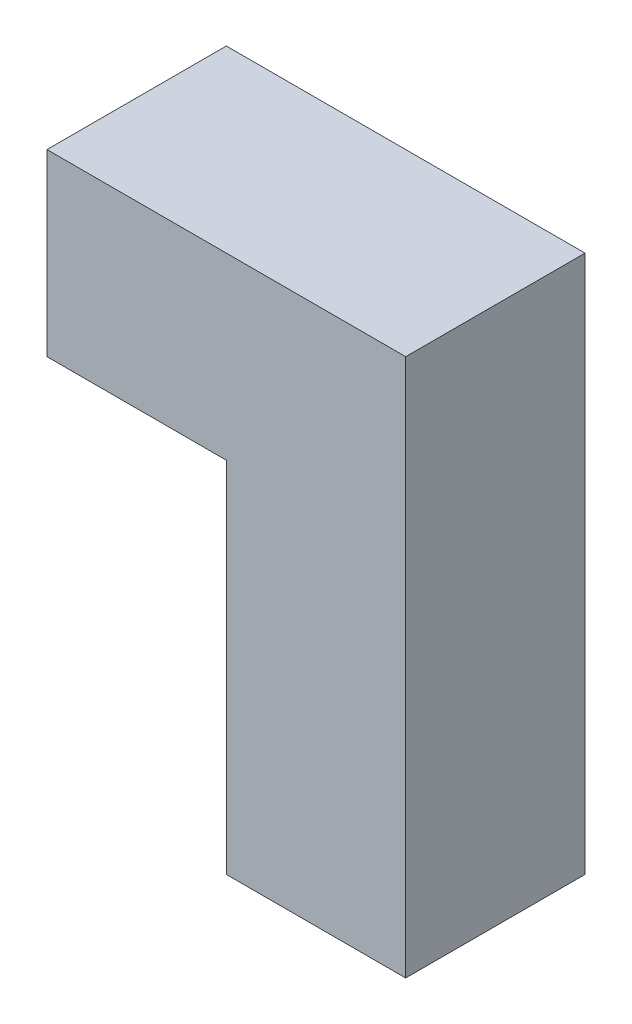
ISO-10303-21;
HEADER;
FILE_DESCRIPTION(('STEP AP214'),'2;1');
FILE_NAME('part.step','',(''),(''),'','','');
FILE_SCHEMA(('AUTOMOTIVE_DESIGN { 1 0 10303 214 1 1 1 1 }'));
ENDSEC;
DATA;
#1=APPLICATION_CONTEXT('core data for automotive mechanical design processes');
#2=APPLICATION_PROTOCOL_DEFINITION('international standard','automotive_design',2000,#1);
#3=PRODUCT_CONTEXT('',#1,'mechanical');
#4=PRODUCT('Part','Part','',(#3));
#5=PRODUCT_RELATED_PRODUCT_CATEGORY('part','',(#4));
#6=PRODUCT_DEFINITION_FORMATION('','',#4);
#7=PRODUCT_DEFINITION_CONTEXT('part definition',#1,'design');
#8=PRODUCT_DEFINITION('design','',#6,#7);
#9=PRODUCT_DEFINITION_SHAPE('','',#8);
#10=(LENGTH_UNIT() NAMED_UNIT(*) SI_UNIT(.MILLI.,.METRE.));
#11=(NAMED_UNIT(*) PLANE_ANGLE_UNIT() SI_UNIT($,.RADIAN.));
#12=(NAMED_UNIT(*) SI_UNIT($,.STERADIAN.) SOLID_ANGLE_UNIT());
#13=UNCERTAINTY_MEASURE_WITH_UNIT(LENGTH_MEASURE(1.E-05),#10,'distance_accuracy_value','');
#14=(GEOMETRIC_REPRESENTATION_CONTEXT(3) GLOBAL_UNCERTAINTY_ASSIGNED_CONTEXT((#13)) GLOBAL_UNIT_ASSIGNED_CONTEXT((#10,
#11,#12)) REPRESENTATION_CONTEXT('',''));
#15=CARTESIAN_POINT('',(0.,0.,0.));
#16=DIRECTION('',(0.,0.,1.));
#17=DIRECTION('',(1.,0.,0.));
#18=AXIS2_PLACEMENT_3D('',#15,#16,#17);
#19=CARTESIAN_POINT('',(30.,45.,15.));
#20=DIRECTION('',(0.,-1.,0.));
#21=DIRECTION('',(0.,0.,-1.));
#22=AXIS2_PLACEMENT_3D('',#19,#20,#21);
#23=PLANE('',#22);
#24=DIRECTION('',(-1.,0.,0.));
#25=VECTOR('',#24,1.);
#26=CARTESIAN_POINT('',(30.,45.,-15.));
#27=LINE('',#26,#25);
#28=CARTESIAN_POINT('',(30.,45.,-15.));
#29=VERTEX_POINT('',#28);
#30=CARTESIAN_POINT('',(-30.,45.,-15.));
#31=VERTEX_POINT('',#30);
#32=EDGE_CURVE('E129',#29,#31,#27,.T.);
#33=ORIENTED_EDGE('',*,*,#32,.T.);
#34=DIRECTION('',(0.,0.,-1.));
#35=VECTOR('',#34,1.);
#36=CARTESIAN_POINT('',(-30.,45.,15.));
#37=LINE('',#36,#35);
#38=CARTESIAN_POINT('',(-30.,45.,15.));
#39=VERTEX_POINT('',#38);
#40=EDGE_CURVE('E11',#39,#31,#37,.T.);
#41=ORIENTED_EDGE('',*,*,#40,.F.);
#42=DIRECTION('',(-1.,0.,0.));
#43=VECTOR('',#42,1.);
#44=CARTESIAN_POINT('',(30.,45.,15.));
#45=LINE('',#44,#43);
#46=CARTESIAN_POINT('',(30.,45.,15.));
#47=VERTEX_POINT('',#46);
#48=EDGE_CURVE('E126',#47,#39,#45,.T.);
#49=ORIENTED_EDGE('',*,*,#48,.F.);
#50=DIRECTION('',(0.,0.,-1.));
#51=VECTOR('',#50,1.);
#52=CARTESIAN_POINT('',(30.,45.,15.));
#53=LINE('',#52,#51);
#54=EDGE_CURVE('E133',#47,#29,#53,.T.);
#55=ORIENTED_EDGE('',*,*,#54,.T.);
#56=EDGE_LOOP('',(#33,#41,#49,#55));
#57=FACE_BOUND('',#56,.T.);
#58=ADVANCED_FACE('F43',(#57),#23,.F.);
#59=CARTESIAN_POINT('',(-30.,-45.,15.));
#60=DIRECTION('',(1.,0.,0.));
#61=DIRECTION('',(0.,0.,-1.));
#62=AXIS2_PLACEMENT_3D('',#59,#60,#61);
#63=PLANE('',#62);
#64=DIRECTION('',(0.,-1.,0.));
#65=VECTOR('',#64,1.);
#66=CARTESIAN_POINT('',(-30.,-45.,-15.));
#67=LINE('',#66,#65);
#68=CARTESIAN_POINT('',(-30.,15.,-15.));
#69=VERTEX_POINT('',#68);
#70=EDGE_CURVE('E124',#31,#69,#67,.T.);
#71=ORIENTED_EDGE('',*,*,#70,.T.);
#72=DIRECTION('',(0.,0.,1.));
#73=VECTOR('',#72,1.);
#74=CARTESIAN_POINT('',(-30.,15.,-15.));
#75=LINE('',#74,#73);
#76=CARTESIAN_POINT('',(-30.,15.,15.));
#77=VERTEX_POINT('',#76);
#78=EDGE_CURVE('E140',#69,#77,#75,.T.);
#79=ORIENTED_EDGE('',*,*,#78,.T.);
#80=DIRECTION('',(0.,-1.,0.));
#81=VECTOR('',#80,1.);
#82=CARTESIAN_POINT('',(-30.,-45.,15.));
#83=LINE('',#82,#81);
#84=EDGE_CURVE('E89',#39,#77,#83,.T.);
#85=ORIENTED_EDGE('',*,*,#84,.F.);
#86=ORIENTED_EDGE('',*,*,#40,.T.);
#87=EDGE_LOOP('',(#71,#79,#85,#86));
#88=FACE_BOUND('',#87,.T.);
#89=ADVANCED_FACE('F150',(#88),#63,.F.);
#90=CARTESIAN_POINT('',(30.,-45.,15.));
#91=DIRECTION('',(0.,1.,0.));
#92=DIRECTION('',(0.,0.,1.));
#93=AXIS2_PLACEMENT_3D('',#90,#91,#92);
#94=PLANE('',#93);
#95=DIRECTION('',(1.,0.,0.));
#96=VECTOR('',#95,1.);
#97=CARTESIAN_POINT('',(30.,-45.,15.));
#98=LINE('',#97,#96);
#99=CARTESIAN_POINT('',(0.,-45.,15.));
#100=VERTEX_POINT('',#99);
#101=CARTESIAN_POINT('',(30.,-45.,15.));
#102=VERTEX_POINT('',#101);
#103=EDGE_CURVE('E120',#100,#102,#98,.T.);
#104=ORIENTED_EDGE('',*,*,#103,.F.);
#105=DIRECTION('',(0.,0.,1.));
#106=VECTOR('',#105,1.);
#107=CARTESIAN_POINT('',(0.,-45.,-15.));
#108=LINE('',#107,#106);
#109=CARTESIAN_POINT('',(0.,-45.,-15.));
#110=VERTEX_POINT('',#109);
#111=EDGE_CURVE('E108',#110,#100,#108,.T.);
#112=ORIENTED_EDGE('',*,*,#111,.F.);
#113=DIRECTION('',(1.,0.,0.));
#114=VECTOR('',#113,1.);
#115=CARTESIAN_POINT('',(30.,-45.,-15.));
#116=LINE('',#115,#114);
#117=CARTESIAN_POINT('',(30.,-45.,-15.));
#118=VERTEX_POINT('',#117);
#119=EDGE_CURVE('E119',#110,#118,#116,.T.);
#120=ORIENTED_EDGE('',*,*,#119,.T.);
#121=DIRECTION('',(0.,0.,-1.));
#122=VECTOR('',#121,1.);
#123=CARTESIAN_POINT('',(30.,-45.,15.));
#124=LINE('',#123,#122);
#125=EDGE_CURVE('E50',#102,#118,#124,.T.);
#126=ORIENTED_EDGE('',*,*,#125,.F.);
#127=EDGE_LOOP('',(#104,#112,#120,#126));
#128=FACE_BOUND('',#127,.T.);
#129=ADVANCED_FACE('F117',(#128),#94,.F.);
#130=CARTESIAN_POINT('',(30.,-45.,15.));
#131=DIRECTION('',(-1.,0.,0.));
#132=DIRECTION('',(0.,0.,1.));
#133=AXIS2_PLACEMENT_3D('',#130,#131,#132);
#134=PLANE('',#133);
#135=DIRECTION('',(0.,1.,0.));
#136=VECTOR('',#135,1.);
#137=CARTESIAN_POINT('',(30.,-45.,-15.));
#138=LINE('',#137,#136);
#139=EDGE_CURVE('E83',#118,#29,#138,.T.);
#140=ORIENTED_EDGE('',*,*,#139,.T.);
#141=ORIENTED_EDGE('',*,*,#54,.F.);
#142=DIRECTION('',(0.,1.,0.));
#143=VECTOR('',#142,1.);
#144=CARTESIAN_POINT('',(30.,-45.,15.));
#145=LINE('',#144,#143);
#146=EDGE_CURVE('E66',#102,#47,#145,.T.);
#147=ORIENTED_EDGE('',*,*,#146,.F.);
#148=ORIENTED_EDGE('',*,*,#125,.T.);
#149=EDGE_LOOP('',(#140,#141,#147,#148));
#150=FACE_BOUND('',#149,.T.);
#151=ADVANCED_FACE('F134',(#150),#134,.F.);
#152=CARTESIAN_POINT('',(0.,0.,15.));
#153=DIRECTION('',(0.,0.,-1.));
#154=DIRECTION('',(-1.,0.,0.));
#155=AXIS2_PLACEMENT_3D('',#152,#153,#154);
#156=PLANE('',#155);
#157=ORIENTED_EDGE('',*,*,#84,.T.);
#158=DIRECTION('',(-1.,0.,0.));
#159=VECTOR('',#158,1.);
#160=CARTESIAN_POINT('',(0.,15.,15.));
#161=LINE('',#160,#159);
#162=CARTESIAN_POINT('',(0.,15.,15.));
#163=VERTEX_POINT('',#162);
#164=EDGE_CURVE('E113',#163,#77,#161,.T.);
#165=ORIENTED_EDGE('',*,*,#164,.F.);
#166=DIRECTION('',(0.,1.,0.));
#167=VECTOR('',#166,1.);
#168=CARTESIAN_POINT('',(0.,0.,15.));
#169=LINE('',#168,#167);
#170=EDGE_CURVE('E152',#100,#163,#169,.T.);
#171=ORIENTED_EDGE('',*,*,#170,.F.);
#172=ORIENTED_EDGE('',*,*,#103,.T.);
#173=ORIENTED_EDGE('',*,*,#146,.T.);
#174=ORIENTED_EDGE('',*,*,#48,.T.);
#175=EDGE_LOOP('',(#157,#165,#171,#172,#173,#174));
#176=FACE_BOUND('',#175,.T.);
#177=ADVANCED_FACE('F149',(#176),#156,.F.);
#178=CARTESIAN_POINT('',(0.,0.,-15.));
#179=DIRECTION('',(0.,0.,-1.));
#180=DIRECTION('',(-1.,0.,0.));
#181=AXIS2_PLACEMENT_3D('',#178,#179,#180);
#182=PLANE('',#181);
#183=DIRECTION('',(-1.,0.,0.));
#184=VECTOR('',#183,1.);
#185=CARTESIAN_POINT('',(0.,15.,-15.));
#186=LINE('',#185,#184);
#187=CARTESIAN_POINT('',(0.,15.,-15.));
#188=VERTEX_POINT('',#187);
#189=EDGE_CURVE('E57',#188,#69,#186,.T.);
#190=ORIENTED_EDGE('',*,*,#189,.T.);
#191=ORIENTED_EDGE('',*,*,#70,.F.);
#192=ORIENTED_EDGE('',*,*,#32,.F.);
#193=ORIENTED_EDGE('',*,*,#139,.F.);
#194=ORIENTED_EDGE('',*,*,#119,.F.);
#195=DIRECTION('',(0.,1.,0.));
#196=VECTOR('',#195,1.);
#197=CARTESIAN_POINT('',(0.,0.,-15.));
#198=LINE('',#197,#196);
#199=EDGE_CURVE('E104',#110,#188,#198,.T.);
#200=ORIENTED_EDGE('',*,*,#199,.T.);
#201=EDGE_LOOP('',(#190,#191,#192,#193,#194,#200));
#202=FACE_BOUND('',#201,.T.);
#203=ADVANCED_FACE('F122',(#202),#182,.T.);
#204=CARTESIAN_POINT('',(0.,15.,-15.));
#205=DIRECTION('',(0.,1.,0.));
#206=DIRECTION('',(-1.,0.,0.));
#207=AXIS2_PLACEMENT_3D('',#204,#205,#206);
#208=PLANE('',#207);
#209=ORIENTED_EDGE('',*,*,#164,.T.);
#210=ORIENTED_EDGE('',*,*,#78,.F.);
#211=ORIENTED_EDGE('',*,*,#189,.F.);
#212=DIRECTION('',(0.,0.,1.));
#213=VECTOR('',#212,1.);
#214=CARTESIAN_POINT('',(0.,15.,-15.));
#215=LINE('',#214,#213);
#216=EDGE_CURVE('E110',#188,#163,#215,.T.);
#217=ORIENTED_EDGE('',*,*,#216,.T.);
#218=EDGE_LOOP('',(#209,#210,#211,#217));
#219=FACE_BOUND('',#218,.T.);
#220=ADVANCED_FACE('F153',(#219),#208,.F.);
#221=CARTESIAN_POINT('',(0.,0.,-15.));
#222=DIRECTION('',(1.,0.,0.));
#223=DIRECTION('',(0.,1.,0.));
#224=AXIS2_PLACEMENT_3D('',#221,#222,#223);
#225=PLANE('',#224);
#226=ORIENTED_EDGE('',*,*,#170,.T.);
#227=ORIENTED_EDGE('',*,*,#216,.F.);
#228=ORIENTED_EDGE('',*,*,#199,.F.);
#229=ORIENTED_EDGE('',*,*,#111,.T.);
#230=EDGE_LOOP('',(#226,#227,#228,#229));
#231=FACE_BOUND('',#230,.T.);
#232=ADVANCED_FACE('F107',(#231),#225,.F.);
#233=CLOSED_SHELL('',(#58,#89,#129,#151,#177,#203,#220,#232));
#234=MANIFOLD_SOLID_BREP('B2',#233);
#235=ADVANCED_BREP_SHAPE_REPRESENTATION('',(#18,#234),#14);
#236=SHAPE_DEFINITION_REPRESENTATION(#9,#235);
ENDSEC;
END-ISO-10303-21;
